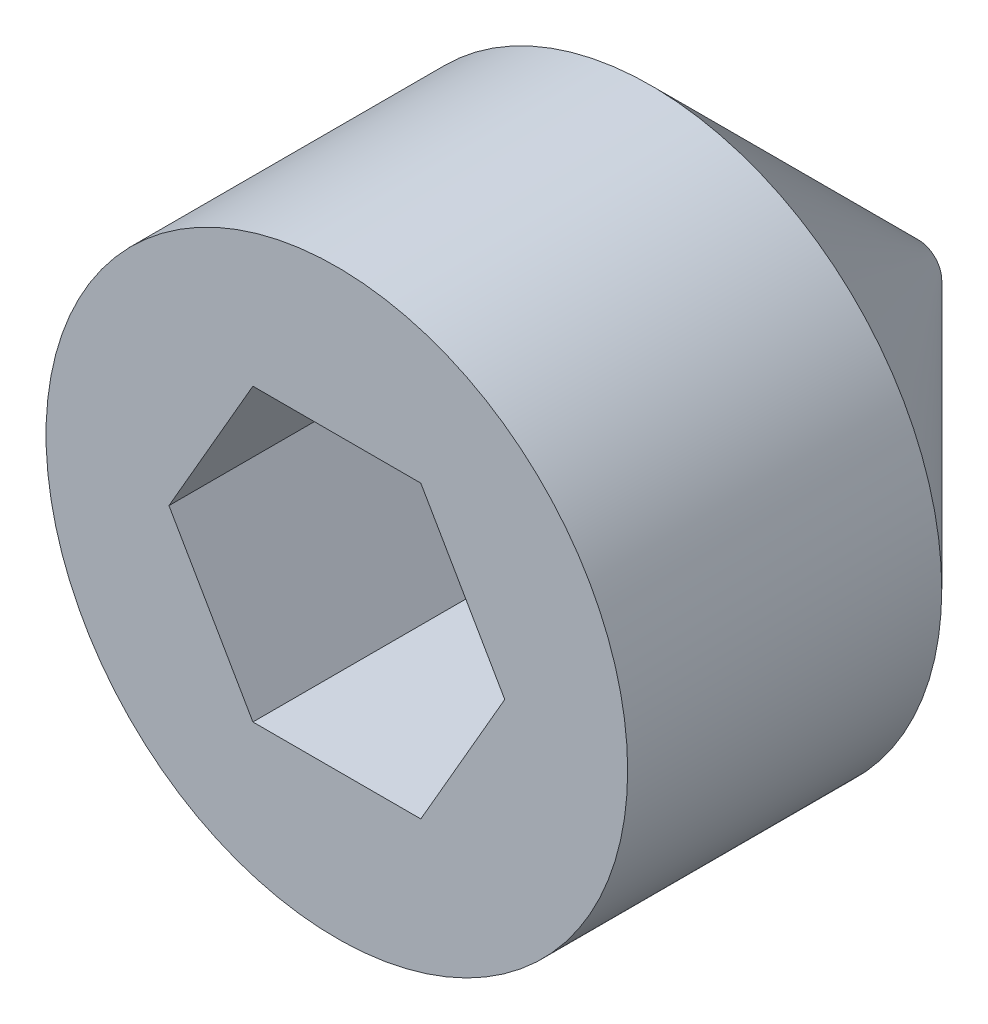
ISO-10303-21;
HEADER;
FILE_DESCRIPTION(('STEP AP214'),'2;1');
FILE_NAME('part.step','',(''),(''),'','','');
FILE_SCHEMA(('AUTOMOTIVE_DESIGN { 1 0 10303 214 1 1 1 1 }'));
ENDSEC;
DATA;
#1=APPLICATION_CONTEXT('core data for automotive mechanical design processes');
#2=APPLICATION_PROTOCOL_DEFINITION('international standard','automotive_design',2000,#1);
#3=PRODUCT_CONTEXT('',#1,'mechanical');
#4=PRODUCT('Part','Part','',(#3));
#5=PRODUCT_RELATED_PRODUCT_CATEGORY('part','',(#4));
#6=PRODUCT_DEFINITION_FORMATION('','',#4);
#7=PRODUCT_DEFINITION_CONTEXT('part definition',#1,'design');
#8=PRODUCT_DEFINITION('design','',#6,#7);
#9=PRODUCT_DEFINITION_SHAPE('','',#8);
#10=(LENGTH_UNIT() NAMED_UNIT(*) SI_UNIT(.MILLI.,.METRE.));
#11=(NAMED_UNIT(*) PLANE_ANGLE_UNIT() SI_UNIT($,.RADIAN.));
#12=(NAMED_UNIT(*) SI_UNIT($,.STERADIAN.) SOLID_ANGLE_UNIT());
#13=UNCERTAINTY_MEASURE_WITH_UNIT(LENGTH_MEASURE(1.E-05),#10,'distance_accuracy_value','');
#14=(GEOMETRIC_REPRESENTATION_CONTEXT(3) GLOBAL_UNCERTAINTY_ASSIGNED_CONTEXT((#13)) GLOBAL_UNIT_ASSIGNED_CONTEXT((#10,
#11,#12)) REPRESENTATION_CONTEXT('',''));
#15=CARTESIAN_POINT('',(0.,0.,0.));
#16=DIRECTION('',(0.,0.,1.));
#17=DIRECTION('',(1.,0.,0.));
#18=AXIS2_PLACEMENT_3D('',#15,#16,#17);
#19=CARTESIAN_POINT('',(0.,0.,-5.));
#20=DIRECTION('',(0.,0.,1.));
#21=DIRECTION('',(1.,0.,0.));
#22=AXIS2_PLACEMENT_3D('',#19,#20,#21);
#23=CYLINDRICAL_SURFACE('',#22,2.5);
#24=CARTESIAN_POINT('',(0.,0.,0.));
#25=DIRECTION('',(0.,0.,1.));
#26=DIRECTION('',(1.,0.,0.));
#27=AXIS2_PLACEMENT_3D('',#24,#25,#26);
#28=CIRCLE('',#27,2.5);
#29=CARTESIAN_POINT('',(2.5,0.,0.));
#30=VERTEX_POINT('',#29);
#31=EDGE_CURVE('E11',#30,#30,#28,.T.);
#32=ORIENTED_EDGE('',*,*,#31,.F.);
#33=EDGE_LOOP('',(#32));
#34=FACE_BOUND('',#33,.T.);
#35=CARTESIAN_POINT('',(0.,0.,-2.70000000000002));
#36=DIRECTION('',(0.,0.,1.));
#37=DIRECTION('',(1.,0.,0.));
#38=AXIS2_PLACEMENT_3D('',#35,#36,#37);
#39=CIRCLE('',#38,2.5);
#40=CARTESIAN_POINT('',(2.5,0.,-2.70000000000002));
#41=VERTEX_POINT('',#40);
#42=EDGE_CURVE('E124',#41,#41,#39,.T.);
#43=ORIENTED_EDGE('',*,*,#42,.T.);
#44=EDGE_LOOP('',(#43));
#45=FACE_BOUND('',#44,.T.);
#46=ADVANCED_FACE('F36',(#34,#45),#23,.T.);
#47=CARTESIAN_POINT('',(0.,0.,0.));
#48=DIRECTION('',(0.,0.,1.));
#49=DIRECTION('',(1.,0.,0.));
#50=AXIS2_PLACEMENT_3D('',#47,#48,#49);
#51=PLANE('',#50);
#52=DIRECTION('',(0.499999999999999,0.866025403784439,0.));
#53=VECTOR('',#52,1.);
#54=CARTESIAN_POINT('',(0.721687836487033,-1.25,0.));
#55=LINE('',#54,#53);
#56=CARTESIAN_POINT('',(0.721687836487033,-1.25,0.));
#57=VERTEX_POINT('',#56);
#58=CARTESIAN_POINT('',(1.44337567297406,0.,0.));
#59=VERTEX_POINT('',#58);
#60=EDGE_CURVE('E50',#57,#59,#55,.T.);
#61=ORIENTED_EDGE('',*,*,#60,.F.);
#62=DIRECTION('',(1.,0.,0.));
#63=VECTOR('',#62,1.);
#64=CARTESIAN_POINT('',(-0.721687836487033,-1.25,0.));
#65=LINE('',#64,#63);
#66=CARTESIAN_POINT('',(-0.721687836487033,-1.25,0.));
#67=VERTEX_POINT('',#66);
#68=EDGE_CURVE('E133',#67,#57,#65,.T.);
#69=ORIENTED_EDGE('',*,*,#68,.F.);
#70=DIRECTION('',(0.5,-0.866025403784438,0.));
#71=VECTOR('',#70,1.);
#72=CARTESIAN_POINT('',(-1.44337567297406,0.,0.));
#73=LINE('',#72,#71);
#74=CARTESIAN_POINT('',(-1.44337567297406,0.,0.));
#75=VERTEX_POINT('',#74);
#76=EDGE_CURVE('E131',#75,#67,#73,.T.);
#77=ORIENTED_EDGE('',*,*,#76,.F.);
#78=DIRECTION('',(-0.499999999999999,-0.866025403784439,0.));
#79=VECTOR('',#78,1.);
#80=CARTESIAN_POINT('',(-0.721687836487033,1.25,0.));
#81=LINE('',#80,#79);
#82=CARTESIAN_POINT('',(-0.721687836487033,1.25,0.));
#83=VERTEX_POINT('',#82);
#84=EDGE_CURVE('E97',#83,#75,#81,.T.);
#85=ORIENTED_EDGE('',*,*,#84,.F.);
#86=DIRECTION('',(-1.,0.,0.));
#87=VECTOR('',#86,1.);
#88=CARTESIAN_POINT('',(0.721687836487032,1.25,0.));
#89=LINE('',#88,#87);
#90=CARTESIAN_POINT('',(0.721687836487032,1.25,0.));
#91=VERTEX_POINT('',#90);
#92=EDGE_CURVE('E127',#91,#83,#89,.T.);
#93=ORIENTED_EDGE('',*,*,#92,.F.);
#94=DIRECTION('',(-0.5,0.866025403784438,0.));
#95=VECTOR('',#94,1.);
#96=CARTESIAN_POINT('',(1.44337567297406,0.,0.));
#97=LINE('',#96,#95);
#98=EDGE_CURVE('E123',#59,#91,#97,.T.);
#99=ORIENTED_EDGE('',*,*,#98,.F.);
#100=EDGE_LOOP('',(#61,#69,#77,#85,#93,#99));
#101=FACE_BOUND('',#100,.T.);
#102=ORIENTED_EDGE('',*,*,#31,.T.);
#103=EDGE_LOOP('',(#102));
#104=FACE_BOUND('',#103,.T.);
#105=ADVANCED_FACE('F145',(#101,#104),#51,.T.);
#106=CARTESIAN_POINT('',(0.721687836487033,-1.25,-2.));
#107=DIRECTION('',(0.866025403784439,-0.499999999999999,0.));
#108=DIRECTION('',(0.499999999999999,0.866025403784439,0.));
#109=AXIS2_PLACEMENT_3D('',#106,#107,#108);
#110=PLANE('',#109);
#111=ORIENTED_EDGE('',*,*,#60,.T.);
#112=DIRECTION('',(0.,0.,1.));
#113=VECTOR('',#112,1.);
#114=CARTESIAN_POINT('',(1.44337567297406,0.,-2.));
#115=LINE('',#114,#113);
#116=CARTESIAN_POINT('',(1.44337567297406,0.,-2.));
#117=VERTEX_POINT('',#116);
#118=EDGE_CURVE('E79',#117,#59,#115,.T.);
#119=ORIENTED_EDGE('',*,*,#118,.F.);
#120=DIRECTION('',(0.499999999999999,0.866025403784439,0.));
#121=VECTOR('',#120,1.);
#122=CARTESIAN_POINT('',(0.721687836487033,-1.25,-2.));
#123=LINE('',#122,#121);
#124=CARTESIAN_POINT('',(0.721687836487033,-1.25,-2.));
#125=VERTEX_POINT('',#124);
#126=EDGE_CURVE('E135',#125,#117,#123,.T.);
#127=ORIENTED_EDGE('',*,*,#126,.F.);
#128=DIRECTION('',(0.,0.,1.));
#129=VECTOR('',#128,1.);
#130=CARTESIAN_POINT('',(0.721687836487033,-1.25,-2.));
#131=LINE('',#130,#129);
#132=EDGE_CURVE('E43',#125,#57,#131,.T.);
#133=ORIENTED_EDGE('',*,*,#132,.T.);
#134=EDGE_LOOP('',(#111,#119,#127,#133));
#135=FACE_BOUND('',#134,.T.);
#136=ADVANCED_FACE('F174',(#135),#110,.F.);
#137=CARTESIAN_POINT('',(-0.721687836487033,-1.25,-2.));
#138=DIRECTION('',(0.,-1.,0.));
#139=DIRECTION('',(1.,0.,0.));
#140=AXIS2_PLACEMENT_3D('',#137,#138,#139);
#141=PLANE('',#140);
#142=ORIENTED_EDGE('',*,*,#68,.T.);
#143=ORIENTED_EDGE('',*,*,#132,.F.);
#144=DIRECTION('',(1.,0.,0.));
#145=VECTOR('',#144,1.);
#146=CARTESIAN_POINT('',(-0.721687836487033,-1.25,-2.));
#147=LINE('',#146,#145);
#148=CARTESIAN_POINT('',(-0.721687836487033,-1.25,-2.));
#149=VERTEX_POINT('',#148);
#150=EDGE_CURVE('E109',#149,#125,#147,.T.);
#151=ORIENTED_EDGE('',*,*,#150,.F.);
#152=DIRECTION('',(0.,0.,1.));
#153=VECTOR('',#152,1.);
#154=CARTESIAN_POINT('',(-0.721687836487033,-1.25,-2.));
#155=LINE('',#154,#153);
#156=EDGE_CURVE('E101',#149,#67,#155,.T.);
#157=ORIENTED_EDGE('',*,*,#156,.T.);
#158=EDGE_LOOP('',(#142,#143,#151,#157));
#159=FACE_BOUND('',#158,.T.);
#160=ADVANCED_FACE('F181',(#159),#141,.F.);
#161=CARTESIAN_POINT('',(-1.44337567297406,0.,-2.));
#162=DIRECTION('',(-0.866025403784438,-0.5,0.));
#163=DIRECTION('',(0.5,-0.866025403784438,0.));
#164=AXIS2_PLACEMENT_3D('',#161,#162,#163);
#165=PLANE('',#164);
#166=ORIENTED_EDGE('',*,*,#76,.T.);
#167=ORIENTED_EDGE('',*,*,#156,.F.);
#168=DIRECTION('',(0.5,-0.866025403784438,0.));
#169=VECTOR('',#168,1.);
#170=CARTESIAN_POINT('',(-1.44337567297406,0.,-2.));
#171=LINE('',#170,#169);
#172=CARTESIAN_POINT('',(-1.44337567297406,0.,-2.));
#173=VERTEX_POINT('',#172);
#174=EDGE_CURVE('E105',#173,#149,#171,.T.);
#175=ORIENTED_EDGE('',*,*,#174,.F.);
#176=DIRECTION('',(0.,0.,1.));
#177=VECTOR('',#176,1.);
#178=CARTESIAN_POINT('',(-1.44337567297406,0.,-2.));
#179=LINE('',#178,#177);
#180=EDGE_CURVE('E90',#173,#75,#179,.T.);
#181=ORIENTED_EDGE('',*,*,#180,.T.);
#182=EDGE_LOOP('',(#166,#167,#175,#181));
#183=FACE_BOUND('',#182,.T.);
#184=ADVANCED_FACE('F106',(#183),#165,.F.);
#185=CARTESIAN_POINT('',(-0.721687836487033,1.25,-2.));
#186=DIRECTION('',(-0.866025403784439,0.499999999999999,0.));
#187=DIRECTION('',(-0.5,-0.866025403784439,0.));
#188=AXIS2_PLACEMENT_3D('',#185,#186,#187);
#189=PLANE('',#188);
#190=ORIENTED_EDGE('',*,*,#84,.T.);
#191=ORIENTED_EDGE('',*,*,#180,.F.);
#192=DIRECTION('',(-0.499999999999999,-0.866025403784439,0.));
#193=VECTOR('',#192,1.);
#194=CARTESIAN_POINT('',(-0.721687836487033,1.25,-2.));
#195=LINE('',#194,#193);
#196=CARTESIAN_POINT('',(-0.721687836487033,1.25,-2.));
#197=VERTEX_POINT('',#196);
#198=EDGE_CURVE('E94',#197,#173,#195,.T.);
#199=ORIENTED_EDGE('',*,*,#198,.F.);
#200=DIRECTION('',(0.,0.,1.));
#201=VECTOR('',#200,1.);
#202=CARTESIAN_POINT('',(-0.721687836487033,1.25,-2.));
#203=LINE('',#202,#201);
#204=EDGE_CURVE('E102',#197,#83,#203,.T.);
#205=ORIENTED_EDGE('',*,*,#204,.T.);
#206=EDGE_LOOP('',(#190,#191,#199,#205));
#207=FACE_BOUND('',#206,.T.);
#208=ADVANCED_FACE('F92',(#207),#189,.F.);
#209=CARTESIAN_POINT('',(0.721687836487032,1.25,-2.));
#210=DIRECTION('',(0.,1.,0.));
#211=DIRECTION('',(0.,0.,1.));
#212=AXIS2_PLACEMENT_3D('',#209,#210,#211);
#213=PLANE('',#212);
#214=ORIENTED_EDGE('',*,*,#92,.T.);
#215=ORIENTED_EDGE('',*,*,#204,.F.);
#216=DIRECTION('',(-1.,0.,0.));
#217=VECTOR('',#216,1.);
#218=CARTESIAN_POINT('',(0.721687836487032,1.25,-2.));
#219=LINE('',#218,#217);
#220=CARTESIAN_POINT('',(0.721687836487032,1.25,-2.));
#221=VERTEX_POINT('',#220);
#222=EDGE_CURVE('E115',#221,#197,#219,.T.);
#223=ORIENTED_EDGE('',*,*,#222,.F.);
#224=DIRECTION('',(0.,0.,1.));
#225=VECTOR('',#224,1.);
#226=CARTESIAN_POINT('',(0.721687836487032,1.25,-2.));
#227=LINE('',#226,#225);
#228=EDGE_CURVE('E139',#221,#91,#227,.T.);
#229=ORIENTED_EDGE('',*,*,#228,.T.);
#230=EDGE_LOOP('',(#214,#215,#223,#229));
#231=FACE_BOUND('',#230,.T.);
#232=ADVANCED_FACE('F149',(#231),#213,.F.);
#233=CARTESIAN_POINT('',(1.44337567297406,0.,-2.));
#234=DIRECTION('',(0.866025403784438,0.5,0.));
#235=DIRECTION('',(-0.5,0.866025403784438,0.));
#236=AXIS2_PLACEMENT_3D('',#233,#234,#235);
#237=PLANE('',#236);
#238=ORIENTED_EDGE('',*,*,#98,.T.);
#239=ORIENTED_EDGE('',*,*,#228,.F.);
#240=DIRECTION('',(-0.5,0.866025403784438,0.));
#241=VECTOR('',#240,1.);
#242=CARTESIAN_POINT('',(1.44337567297406,0.,-2.));
#243=LINE('',#242,#241);
#244=EDGE_CURVE('E117',#117,#221,#243,.T.);
#245=ORIENTED_EDGE('',*,*,#244,.F.);
#246=ORIENTED_EDGE('',*,*,#118,.T.);
#247=EDGE_LOOP('',(#238,#239,#245,#246));
#248=FACE_BOUND('',#247,.T.);
#249=ADVANCED_FACE('F142',(#248),#237,.F.);
#250=CARTESIAN_POINT('',(0.,0.,-2.));
#251=DIRECTION('',(0.,0.,1.));
#252=DIRECTION('',(1.,0.,0.));
#253=AXIS2_PLACEMENT_3D('',#250,#251,#252);
#254=PLANE('',#253);
#255=ORIENTED_EDGE('',*,*,#126,.T.);
#256=ORIENTED_EDGE('',*,*,#244,.T.);
#257=ORIENTED_EDGE('',*,*,#222,.T.);
#258=ORIENTED_EDGE('',*,*,#198,.T.);
#259=ORIENTED_EDGE('',*,*,#174,.T.);
#260=ORIENTED_EDGE('',*,*,#150,.T.);
#261=EDGE_LOOP('',(#255,#256,#257,#258,#259,#260));
#262=FACE_BOUND('',#261,.T.);
#263=ADVANCED_FACE('F112',(#262),#254,.T.);
#264=CARTESIAN_POINT('',(0.,0.,-2.70000000000002));
#265=DIRECTION('',(0.,0.,1.));
#266=DIRECTION('',(1.,0.,0.));
#267=AXIS2_PLACEMENT_3D('',#264,#265,#266);
#268=CONICAL_SURFACE('',#267,2.5,0.785398163397453);
#269=CARTESIAN_POINT('',(0.,0.,-5.));
#270=DIRECTION('',(0.,0.,1.));
#271=DIRECTION('',(1.,0.,0.));
#272=AXIS2_PLACEMENT_3D('',#269,#270,#271);
#273=CIRCLE('',#272,0.2);
#274=CARTESIAN_POINT('',(0.2,0.,-5.));
#275=VERTEX_POINT('',#274);
#276=EDGE_CURVE('E154',#275,#275,#273,.T.);
#277=CARTESIAN_POINT('',(0.2,0.,-5.));
#278=CARTESIAN_POINT('',(0.223958333333333,0.,-4.97604166666667));
#279=CARTESIAN_POINT('',(0.247916666666667,0.,-4.95208333333333));
#280=CARTESIAN_POINT('',(0.295833333333333,0.,-4.90416666666667));
#281=CARTESIAN_POINT('',(0.319791666666666,0.,-4.88020833333334));
#282=CARTESIAN_POINT('',(0.367708333333333,0.,-4.83229166666667));
#283=CARTESIAN_POINT('',(0.391666666666666,0.,-4.80833333333334));
#284=CARTESIAN_POINT('',(0.439583333333333,0.,-4.76041666666667));
#285=CARTESIAN_POINT('',(0.463541666666666,0.,-4.73645833333334));
#286=CARTESIAN_POINT('',(0.511458333333333,0.,-4.68854166666667));
#287=CARTESIAN_POINT('',(0.535416666666666,0.,-4.66458333333334));
#288=CARTESIAN_POINT('',(0.583333333333333,0.,-4.61666666666667));
#289=CARTESIAN_POINT('',(0.607291666666666,0.,-4.59270833333334));
#290=CARTESIAN_POINT('',(0.655208333333333,0.,-4.54479166666667));
#291=CARTESIAN_POINT('',(0.679166666666666,0.,-4.52083333333334));
#292=CARTESIAN_POINT('',(0.727083333333333,0.,-4.47291666666667));
#293=CARTESIAN_POINT('',(0.751041666666666,0.,-4.44895833333334));
#294=CARTESIAN_POINT('',(0.798958333333333,0.,-4.40104166666667));
#295=CARTESIAN_POINT('',(0.822916666666666,0.,-4.37708333333334));
#296=CARTESIAN_POINT('',(0.870833333333333,0.,-4.32916666666667));
#297=CARTESIAN_POINT('',(0.894791666666666,0.,-4.30520833333334));
#298=CARTESIAN_POINT('',(0.942708333333333,0.,-4.25729166666668));
#299=CARTESIAN_POINT('',(0.966666666666666,0.,-4.23333333333334));
#300=CARTESIAN_POINT('',(1.01458333333333,0.,-4.18541666666667));
#301=CARTESIAN_POINT('',(1.03854166666667,0.,-4.16145833333334));
#302=CARTESIAN_POINT('',(1.08645833333333,0.,-4.11354166666668));
#303=CARTESIAN_POINT('',(1.11041666666667,0.,-4.08958333333334));
#304=CARTESIAN_POINT('',(1.15833333333333,0.,-4.04166666666668));
#305=CARTESIAN_POINT('',(1.18229166666667,0.,-4.01770833333334));
#306=CARTESIAN_POINT('',(1.23020833333333,0.,-3.96979166666668));
#307=CARTESIAN_POINT('',(1.25416666666667,0.,-3.94583333333335));
#308=CARTESIAN_POINT('',(1.30208333333333,0.,-3.89791666666668));
#309=CARTESIAN_POINT('',(1.32604166666667,0.,-3.87395833333335));
#310=CARTESIAN_POINT('',(1.37395833333333,0.,-3.82604166666668));
#311=CARTESIAN_POINT('',(1.39791666666667,0.,-3.80208333333335));
#312=CARTESIAN_POINT('',(1.44583333333333,0.,-3.75416666666668));
#313=CARTESIAN_POINT('',(1.46979166666667,0.,-3.73020833333335));
#314=CARTESIAN_POINT('',(1.51770833333333,0.,-3.68229166666668));
#315=CARTESIAN_POINT('',(1.54166666666667,0.,-3.65833333333335));
#316=CARTESIAN_POINT('',(1.58958333333333,0.,-3.61041666666668));
#317=CARTESIAN_POINT('',(1.61354166666667,0.,-3.58645833333335));
#318=CARTESIAN_POINT('',(1.66145833333333,0.,-3.53854166666668));
#319=CARTESIAN_POINT('',(1.68541666666667,0.,-3.51458333333335));
#320=CARTESIAN_POINT('',(1.73333333333333,0.,-3.46666666666668));
#321=CARTESIAN_POINT('',(1.75729166666667,0.,-3.44270833333335));
#322=CARTESIAN_POINT('',(1.80520833333333,0.,-3.39479166666668));
#323=CARTESIAN_POINT('',(1.82916666666667,0.,-3.37083333333335));
#324=CARTESIAN_POINT('',(1.87708333333333,0.,-3.32291666666668));
#325=CARTESIAN_POINT('',(1.90104166666667,0.,-3.29895833333335));
#326=CARTESIAN_POINT('',(1.94895833333333,0.,-3.25104166666669));
#327=CARTESIAN_POINT('',(1.97291666666667,0.,-3.22708333333335));
#328=CARTESIAN_POINT('',(2.02083333333333,0.,-3.17916666666669));
#329=CARTESIAN_POINT('',(2.04479166666667,0.,-3.15520833333335));
#330=CARTESIAN_POINT('',(2.09270833333333,0.,-3.10729166666669));
#331=CARTESIAN_POINT('',(2.11666666666667,0.,-3.08333333333335));
#332=CARTESIAN_POINT('',(2.16458333333333,0.,-3.03541666666669));
#333=CARTESIAN_POINT('',(2.18854166666667,0.,-3.01145833333335));
#334=CARTESIAN_POINT('',(2.23645833333333,0.,-2.96354166666669));
#335=CARTESIAN_POINT('',(2.26041666666667,0.,-2.93958333333336));
#336=CARTESIAN_POINT('',(2.30833333333333,0.,-2.89166666666669));
#337=CARTESIAN_POINT('',(2.33229166666667,0.,-2.86770833333336));
#338=CARTESIAN_POINT('',(2.38020833333333,0.,-2.81979166666669));
#339=CARTESIAN_POINT('',(2.40416666666667,0.,-2.79583333333336));
#340=CARTESIAN_POINT('',(2.45208333333333,0.,-2.74791666666669));
#341=CARTESIAN_POINT('',(2.47604166666667,0.,-2.72395833333336));
#342=CARTESIAN_POINT('',(2.5,0.,-2.70000000000002));
#343=B_SPLINE_CURVE_WITH_KNOTS('',3,(#277,#278,#279,#280,#281,#282,#283,#284,#285,#286,#287,
#288,#289,#290,#291,#292,#293,#294,#295,#296,#297,#298,#299,#300,#301,#302,#303,#304,#305,#306,
#307,#308,#309,#310,#311,#312,#313,#314,#315,#316,#317,#318,#319,#320,#321,#322,#323,#324,#325,
#326,#327,#328,#329,#330,#331,#332,#333,#334,#335,#336,#337,#338,#339,#340,#341,#342),
.UNSPECIFIED.,.F.,.F.,(4,2,2,2,2,2,2,2,2,2,2,2,2,2,2,2,2,2,2,2,2,2,2,2,2,2,2,2,2,2,2,2,4),(0.,
0.101646599795566,0.203293199591131,0.304939799386698,0.406586399182263,0.508232998977829,
0.609879598773394,0.71152619856896,0.813172798364525,0.914819398160092,1.01646599795566,
1.11811259775122,1.21975919754679,1.32140579734235,1.42305239713792,1.52469899693348,
1.62634559672905,1.72799219652462,1.82963879632018,1.93128539611575,2.03293199591131,
2.13457859570688,2.23622519550244,2.33787179529801,2.43951839509358,2.54116499488914,
2.64281159468471,2.74445819448027,2.84610479427584,2.9477513940714,3.04939799386697,
3.15104459366254,3.2526911934581),.UNSPECIFIED.);
#344=EDGE_CURVE('BSEAM158',#275,#41,#343,.T.);
#345=ORIENTED_EDGE('',*,*,#276,.T.);
#346=ORIENTED_EDGE('',*,*,#42,.F.);
#347=ORIENTED_EDGE('',*,*,#344,.T.);
#348=ORIENTED_EDGE('',*,*,#344,.F.);
#349=EDGE_LOOP('',(#345,#347,#346,#348));
#350=FACE_BOUND('',#349,.T.);
#351=ADVANCED_FACE('F158',(#350),#268,.T.);
#352=CARTESIAN_POINT('',(0.,0.,-5.));
#353=DIRECTION('',(0.,0.,1.));
#354=DIRECTION('',(1.,0.,0.));
#355=AXIS2_PLACEMENT_3D('',#352,#353,#354);
#356=PLANE('',#355);
#357=ORIENTED_EDGE('',*,*,#276,.F.);
#358=EDGE_LOOP('',(#357));
#359=FACE_BOUND('',#358,.T.);
#360=ADVANCED_FACE('F161',(#359),#356,.F.);
#361=CLOSED_SHELL('',(#46,#105,#136,#160,#184,#208,#232,#249,#263,#351,#360));
#362=MANIFOLD_SOLID_BREP('B2',#361);
#363=ADVANCED_BREP_SHAPE_REPRESENTATION('',(#18,#362),#14);
#364=SHAPE_DEFINITION_REPRESENTATION(#9,#363);
ENDSEC;
END-ISO-10303-21;
